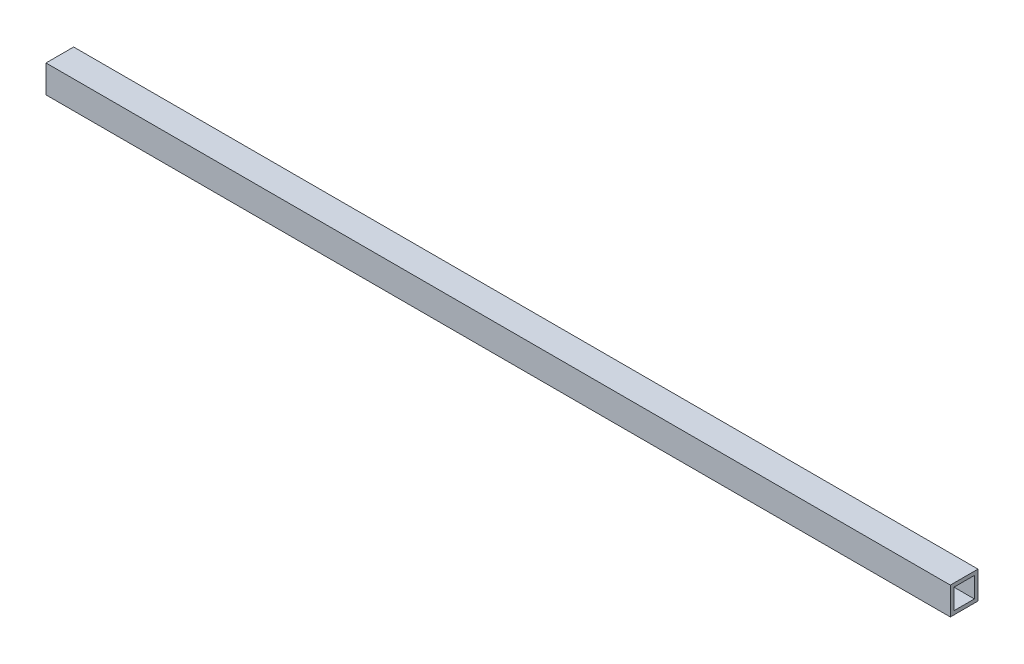
ISO-10303-21;
HEADER;
FILE_DESCRIPTION(('STEP AP214'),'2;1');
FILE_NAME('part.step','',(''),(''),'','','');
FILE_SCHEMA(('AUTOMOTIVE_DESIGN { 1 0 10303 214 1 1 1 1 }'));
ENDSEC;
DATA;
#1=APPLICATION_CONTEXT('core data for automotive mechanical design processes');
#2=APPLICATION_PROTOCOL_DEFINITION('international standard','automotive_design',2000,#1);
#3=PRODUCT_CONTEXT('',#1,'mechanical');
#4=PRODUCT('Part','Part','',(#3));
#5=PRODUCT_RELATED_PRODUCT_CATEGORY('part','',(#4));
#6=PRODUCT_DEFINITION_FORMATION('','',#4);
#7=PRODUCT_DEFINITION_CONTEXT('part definition',#1,'design');
#8=PRODUCT_DEFINITION('design','',#6,#7);
#9=PRODUCT_DEFINITION_SHAPE('','',#8);
#10=(LENGTH_UNIT() NAMED_UNIT(*) SI_UNIT(.MILLI.,.METRE.));
#11=(NAMED_UNIT(*) PLANE_ANGLE_UNIT() SI_UNIT($,.RADIAN.));
#12=(NAMED_UNIT(*) SI_UNIT($,.STERADIAN.) SOLID_ANGLE_UNIT());
#13=UNCERTAINTY_MEASURE_WITH_UNIT(LENGTH_MEASURE(1.E-05),#10,'distance_accuracy_value','');
#14=(GEOMETRIC_REPRESENTATION_CONTEXT(3) GLOBAL_UNCERTAINTY_ASSIGNED_CONTEXT((#13)) GLOBAL_UNIT_ASSIGNED_CONTEXT((#10,
#11,#12)) REPRESENTATION_CONTEXT('',''));
#15=CARTESIAN_POINT('',(0.,0.,0.));
#16=DIRECTION('',(0.,0.,1.));
#17=DIRECTION('',(1.,0.,0.));
#18=AXIS2_PLACEMENT_3D('',#15,#16,#17);
#19=CARTESIAN_POINT('',(1242.,0.,0.));
#20=DIRECTION('',(-1.,0.,0.));
#21=DIRECTION('',(0.,0.,1.));
#22=AXIS2_PLACEMENT_3D('',#19,#20,#21);
#23=PLANE('',#22);
#24=DIRECTION('',(0.,-1.,0.));
#25=VECTOR('',#24,1.);
#26=CARTESIAN_POINT('',(1242.,0.,0.));
#27=LINE('',#26,#25);
#28=CARTESIAN_POINT('',(1242.,38.,0.));
#29=VERTEX_POINT('',#28);
#30=CARTESIAN_POINT('',(1242.,0.,0.));
#31=VERTEX_POINT('',#30);
#32=EDGE_CURVE('E133',#29,#31,#27,.T.);
#33=ORIENTED_EDGE('',*,*,#32,.T.);
#34=DIRECTION('',(0.,0.,-1.));
#35=VECTOR('',#34,1.);
#36=CARTESIAN_POINT('',(1242.,0.,0.));
#37=LINE('',#36,#35);
#38=CARTESIAN_POINT('',(1242.,0.,-38.));
#39=VERTEX_POINT('',#38);
#40=EDGE_CURVE('E136',#31,#39,#37,.T.);
#41=ORIENTED_EDGE('',*,*,#40,.T.);
#42=DIRECTION('',(0.,1.,0.));
#43=VECTOR('',#42,1.);
#44=CARTESIAN_POINT('',(1242.,0.,-38.));
#45=LINE('',#44,#43);
#46=CARTESIAN_POINT('',(1242.,38.,-38.));
#47=VERTEX_POINT('',#46);
#48=EDGE_CURVE('E139',#39,#47,#45,.T.);
#49=ORIENTED_EDGE('',*,*,#48,.T.);
#50=DIRECTION('',(0.,0.,1.));
#51=VECTOR('',#50,1.);
#52=CARTESIAN_POINT('',(1242.,38.,0.));
#53=LINE('',#52,#51);
#54=EDGE_CURVE('E141',#47,#29,#53,.T.);
#55=ORIENTED_EDGE('',*,*,#54,.T.);
#56=EDGE_LOOP('',(#33,#41,#49,#55));
#57=FACE_BOUND('',#56,.T.);
#58=DIRECTION('',(0.,0.,-1.));
#59=VECTOR('',#58,1.);
#60=CARTESIAN_POINT('',(1242.,5.,-5.));
#61=LINE('',#60,#59);
#62=CARTESIAN_POINT('',(1242.,5.,-5.));
#63=VERTEX_POINT('',#62);
#64=CARTESIAN_POINT('',(1242.,5.,-33.));
#65=VERTEX_POINT('',#64);
#66=EDGE_CURVE('E97',#63,#65,#61,.T.);
#67=ORIENTED_EDGE('',*,*,#66,.F.);
#68=DIRECTION('',(0.,-1.,0.));
#69=VECTOR('',#68,1.);
#70=CARTESIAN_POINT('',(1242.,5.,-5.));
#71=LINE('',#70,#69);
#72=CARTESIAN_POINT('',(1242.,33.,-5.));
#73=VERTEX_POINT('',#72);
#74=EDGE_CURVE('E119',#73,#63,#71,.T.);
#75=ORIENTED_EDGE('',*,*,#74,.F.);
#76=DIRECTION('',(0.,0.,1.));
#77=VECTOR('',#76,1.);
#78=CARTESIAN_POINT('',(1242.,33.,-5.));
#79=LINE('',#78,#77);
#80=CARTESIAN_POINT('',(1242.,33.,-33.));
#81=VERTEX_POINT('',#80);
#82=EDGE_CURVE('E117',#81,#73,#79,.T.);
#83=ORIENTED_EDGE('',*,*,#82,.F.);
#84=DIRECTION('',(0.,1.,0.));
#85=VECTOR('',#84,1.);
#86=CARTESIAN_POINT('',(1242.,5.,-33.));
#87=LINE('',#86,#85);
#88=EDGE_CURVE('E105',#65,#81,#87,.T.);
#89=ORIENTED_EDGE('',*,*,#88,.F.);
#90=EDGE_LOOP('',(#67,#75,#83,#89));
#91=FACE_BOUND('',#90,.T.);
#92=ADVANCED_FACE('F32',(#57,#91),#23,.F.);
#93=CARTESIAN_POINT('',(0.,0.,0.));
#94=DIRECTION('',(-1.,0.,0.));
#95=DIRECTION('',(0.,0.,1.));
#96=AXIS2_PLACEMENT_3D('',#93,#94,#95);
#97=PLANE('',#96);
#98=DIRECTION('',(0.,-1.,0.));
#99=VECTOR('',#98,1.);
#100=CARTESIAN_POINT('',(0.,0.,0.));
#101=LINE('',#100,#99);
#102=CARTESIAN_POINT('',(0.,38.,0.));
#103=VERTEX_POINT('',#102);
#104=CARTESIAN_POINT('',(0.,0.,0.));
#105=VERTEX_POINT('',#104);
#106=EDGE_CURVE('E113',#103,#105,#101,.T.);
#107=ORIENTED_EDGE('',*,*,#106,.F.);
#108=DIRECTION('',(0.,0.,1.));
#109=VECTOR('',#108,1.);
#110=CARTESIAN_POINT('',(0.,38.,0.));
#111=LINE('',#110,#109);
#112=CARTESIAN_POINT('',(0.,38.,-38.));
#113=VERTEX_POINT('',#112);
#114=EDGE_CURVE('E137',#113,#103,#111,.T.);
#115=ORIENTED_EDGE('',*,*,#114,.F.);
#116=DIRECTION('',(0.,1.,0.));
#117=VECTOR('',#116,1.);
#118=CARTESIAN_POINT('',(0.,0.,-38.));
#119=LINE('',#118,#117);
#120=CARTESIAN_POINT('',(0.,0.,-38.));
#121=VERTEX_POINT('',#120);
#122=EDGE_CURVE('E148',#121,#113,#119,.T.);
#123=ORIENTED_EDGE('',*,*,#122,.F.);
#124=DIRECTION('',(0.,0.,-1.));
#125=VECTOR('',#124,1.);
#126=CARTESIAN_POINT('',(0.,0.,0.));
#127=LINE('',#126,#125);
#128=EDGE_CURVE('E146',#105,#121,#127,.T.);
#129=ORIENTED_EDGE('',*,*,#128,.F.);
#130=EDGE_LOOP('',(#107,#115,#123,#129));
#131=FACE_BOUND('',#130,.T.);
#132=DIRECTION('',(0.,-1.,0.));
#133=VECTOR('',#132,1.);
#134=CARTESIAN_POINT('',(0.,5.,-5.));
#135=LINE('',#134,#133);
#136=CARTESIAN_POINT('',(0.,33.,-5.));
#137=VERTEX_POINT('',#136);
#138=CARTESIAN_POINT('',(0.,5.,-5.));
#139=VERTEX_POINT('',#138);
#140=EDGE_CURVE('E106',#137,#139,#135,.T.);
#141=ORIENTED_EDGE('',*,*,#140,.T.);
#142=DIRECTION('',(0.,0.,-1.));
#143=VECTOR('',#142,1.);
#144=CARTESIAN_POINT('',(0.,5.,-5.));
#145=LINE('',#144,#143);
#146=CARTESIAN_POINT('',(0.,5.,-33.));
#147=VERTEX_POINT('',#146);
#148=EDGE_CURVE('E55',#139,#147,#145,.T.);
#149=ORIENTED_EDGE('',*,*,#148,.T.);
#150=DIRECTION('',(0.,1.,0.));
#151=VECTOR('',#150,1.);
#152=CARTESIAN_POINT('',(0.,5.,-33.));
#153=LINE('',#152,#151);
#154=CARTESIAN_POINT('',(0.,33.,-33.));
#155=VERTEX_POINT('',#154);
#156=EDGE_CURVE('E112',#147,#155,#153,.T.);
#157=ORIENTED_EDGE('',*,*,#156,.T.);
#158=DIRECTION('',(0.,0.,1.));
#159=VECTOR('',#158,1.);
#160=CARTESIAN_POINT('',(0.,33.,-5.));
#161=LINE('',#160,#159);
#162=EDGE_CURVE('E125',#155,#137,#161,.T.);
#163=ORIENTED_EDGE('',*,*,#162,.T.);
#164=EDGE_LOOP('',(#141,#149,#157,#163));
#165=FACE_BOUND('',#164,.T.);
#166=ADVANCED_FACE('F166',(#131,#165),#97,.T.);
#167=CARTESIAN_POINT('',(1242.,0.,0.));
#168=DIRECTION('',(0.,0.,-1.));
#169=DIRECTION('',(-1.,0.,0.));
#170=AXIS2_PLACEMENT_3D('',#167,#168,#169);
#171=PLANE('',#170);
#172=ORIENTED_EDGE('',*,*,#106,.T.);
#173=DIRECTION('',(-1.,0.,0.));
#174=VECTOR('',#173,1.);
#175=CARTESIAN_POINT('',(1242.,0.,0.));
#176=LINE('',#175,#174);
#177=EDGE_CURVE('E11',#31,#105,#176,.T.);
#178=ORIENTED_EDGE('',*,*,#177,.F.);
#179=ORIENTED_EDGE('',*,*,#32,.F.);
#180=DIRECTION('',(-1.,0.,0.));
#181=VECTOR('',#180,1.);
#182=CARTESIAN_POINT('',(1242.,38.,0.));
#183=LINE('',#182,#181);
#184=EDGE_CURVE('E143',#29,#103,#183,.T.);
#185=ORIENTED_EDGE('',*,*,#184,.T.);
#186=EDGE_LOOP('',(#172,#178,#179,#185));
#187=FACE_BOUND('',#186,.T.);
#188=ADVANCED_FACE('F34',(#187),#171,.F.);
#189=CARTESIAN_POINT('',(1242.,0.,0.));
#190=DIRECTION('',(0.,1.,0.));
#191=DIRECTION('',(0.,0.,1.));
#192=AXIS2_PLACEMENT_3D('',#189,#190,#191);
#193=PLANE('',#192);
#194=ORIENTED_EDGE('',*,*,#128,.T.);
#195=DIRECTION('',(-1.,0.,0.));
#196=VECTOR('',#195,1.);
#197=CARTESIAN_POINT('',(1242.,0.,-38.));
#198=LINE('',#197,#196);
#199=EDGE_CURVE('E40',#39,#121,#198,.T.);
#200=ORIENTED_EDGE('',*,*,#199,.F.);
#201=ORIENTED_EDGE('',*,*,#40,.F.);
#202=ORIENTED_EDGE('',*,*,#177,.T.);
#203=EDGE_LOOP('',(#194,#200,#201,#202));
#204=FACE_BOUND('',#203,.T.);
#205=ADVANCED_FACE('F176',(#204),#193,.F.);
#206=CARTESIAN_POINT('',(1242.,0.,-38.));
#207=DIRECTION('',(0.,0.,1.));
#208=DIRECTION('',(1.,0.,0.));
#209=AXIS2_PLACEMENT_3D('',#206,#207,#208);
#210=PLANE('',#209);
#211=ORIENTED_EDGE('',*,*,#122,.T.);
#212=DIRECTION('',(-1.,0.,0.));
#213=VECTOR('',#212,1.);
#214=CARTESIAN_POINT('',(1242.,38.,-38.));
#215=LINE('',#214,#213);
#216=EDGE_CURVE('E153',#47,#113,#215,.T.);
#217=ORIENTED_EDGE('',*,*,#216,.F.);
#218=ORIENTED_EDGE('',*,*,#48,.F.);
#219=ORIENTED_EDGE('',*,*,#199,.T.);
#220=EDGE_LOOP('',(#211,#217,#218,#219));
#221=FACE_BOUND('',#220,.T.);
#222=ADVANCED_FACE('F160',(#221),#210,.F.);
#223=CARTESIAN_POINT('',(1242.,38.,0.));
#224=DIRECTION('',(0.,-1.,0.));
#225=DIRECTION('',(0.,0.,-1.));
#226=AXIS2_PLACEMENT_3D('',#223,#224,#225);
#227=PLANE('',#226);
#228=ORIENTED_EDGE('',*,*,#114,.T.);
#229=ORIENTED_EDGE('',*,*,#184,.F.);
#230=ORIENTED_EDGE('',*,*,#54,.F.);
#231=ORIENTED_EDGE('',*,*,#216,.T.);
#232=EDGE_LOOP('',(#228,#229,#230,#231));
#233=FACE_BOUND('',#232,.T.);
#234=ADVANCED_FACE('F170',(#233),#227,.F.);
#235=CARTESIAN_POINT('',(1242.,5.,-5.));
#236=DIRECTION('',(0.,1.,0.));
#237=DIRECTION('',(0.,0.,1.));
#238=AXIS2_PLACEMENT_3D('',#235,#236,#237);
#239=PLANE('',#238);
#240=ORIENTED_EDGE('',*,*,#148,.F.);
#241=DIRECTION('',(-1.,0.,0.));
#242=VECTOR('',#241,1.);
#243=CARTESIAN_POINT('',(1242.,5.,-5.));
#244=LINE('',#243,#242);
#245=EDGE_CURVE('E101',#63,#139,#244,.T.);
#246=ORIENTED_EDGE('',*,*,#245,.F.);
#247=ORIENTED_EDGE('',*,*,#66,.T.);
#248=DIRECTION('',(-1.,0.,0.));
#249=VECTOR('',#248,1.);
#250=CARTESIAN_POINT('',(1242.,5.,-33.));
#251=LINE('',#250,#249);
#252=EDGE_CURVE('E100',#65,#147,#251,.T.);
#253=ORIENTED_EDGE('',*,*,#252,.T.);
#254=EDGE_LOOP('',(#240,#246,#247,#253));
#255=FACE_BOUND('',#254,.T.);
#256=ADVANCED_FACE('F99',(#255),#239,.T.);
#257=CARTESIAN_POINT('',(1242.,5.,-33.));
#258=DIRECTION('',(0.,0.,1.));
#259=DIRECTION('',(1.,0.,0.));
#260=AXIS2_PLACEMENT_3D('',#257,#258,#259);
#261=PLANE('',#260);
#262=ORIENTED_EDGE('',*,*,#156,.F.);
#263=ORIENTED_EDGE('',*,*,#252,.F.);
#264=ORIENTED_EDGE('',*,*,#88,.T.);
#265=DIRECTION('',(-1.,0.,0.));
#266=VECTOR('',#265,1.);
#267=CARTESIAN_POINT('',(1242.,33.,-33.));
#268=LINE('',#267,#266);
#269=EDGE_CURVE('E114',#81,#155,#268,.T.);
#270=ORIENTED_EDGE('',*,*,#269,.T.);
#271=EDGE_LOOP('',(#262,#263,#264,#270));
#272=FACE_BOUND('',#271,.T.);
#273=ADVANCED_FACE('F109',(#272),#261,.T.);
#274=CARTESIAN_POINT('',(1242.,33.,-5.));
#275=DIRECTION('',(0.,-1.,0.));
#276=DIRECTION('',(0.,0.,-1.));
#277=AXIS2_PLACEMENT_3D('',#274,#275,#276);
#278=PLANE('',#277);
#279=ORIENTED_EDGE('',*,*,#162,.F.);
#280=ORIENTED_EDGE('',*,*,#269,.F.);
#281=ORIENTED_EDGE('',*,*,#82,.T.);
#282=DIRECTION('',(-1.,0.,0.));
#283=VECTOR('',#282,1.);
#284=CARTESIAN_POINT('',(1242.,33.,-5.));
#285=LINE('',#284,#283);
#286=EDGE_CURVE('E47',#73,#137,#285,.T.);
#287=ORIENTED_EDGE('',*,*,#286,.T.);
#288=EDGE_LOOP('',(#279,#280,#281,#287));
#289=FACE_BOUND('',#288,.T.);
#290=ADVANCED_FACE('F199',(#289),#278,.T.);
#291=CARTESIAN_POINT('',(1242.,5.,-5.));
#292=DIRECTION('',(0.,0.,-1.));
#293=DIRECTION('',(-1.,0.,0.));
#294=AXIS2_PLACEMENT_3D('',#291,#292,#293);
#295=PLANE('',#294);
#296=ORIENTED_EDGE('',*,*,#140,.F.);
#297=ORIENTED_EDGE('',*,*,#286,.F.);
#298=ORIENTED_EDGE('',*,*,#74,.T.);
#299=ORIENTED_EDGE('',*,*,#245,.T.);
#300=EDGE_LOOP('',(#296,#297,#298,#299));
#301=FACE_BOUND('',#300,.T.);
#302=ADVANCED_FACE('F203',(#301),#295,.T.);
#303=CLOSED_SHELL('',(#92,#166,#188,#205,#222,#234,#256,#273,#290,#302));
#304=MANIFOLD_SOLID_BREP('B2',#303);
#305=ADVANCED_BREP_SHAPE_REPRESENTATION('',(#18,#304),#14);
#306=SHAPE_DEFINITION_REPRESENTATION(#9,#305);
ENDSEC;
END-ISO-10303-21;
